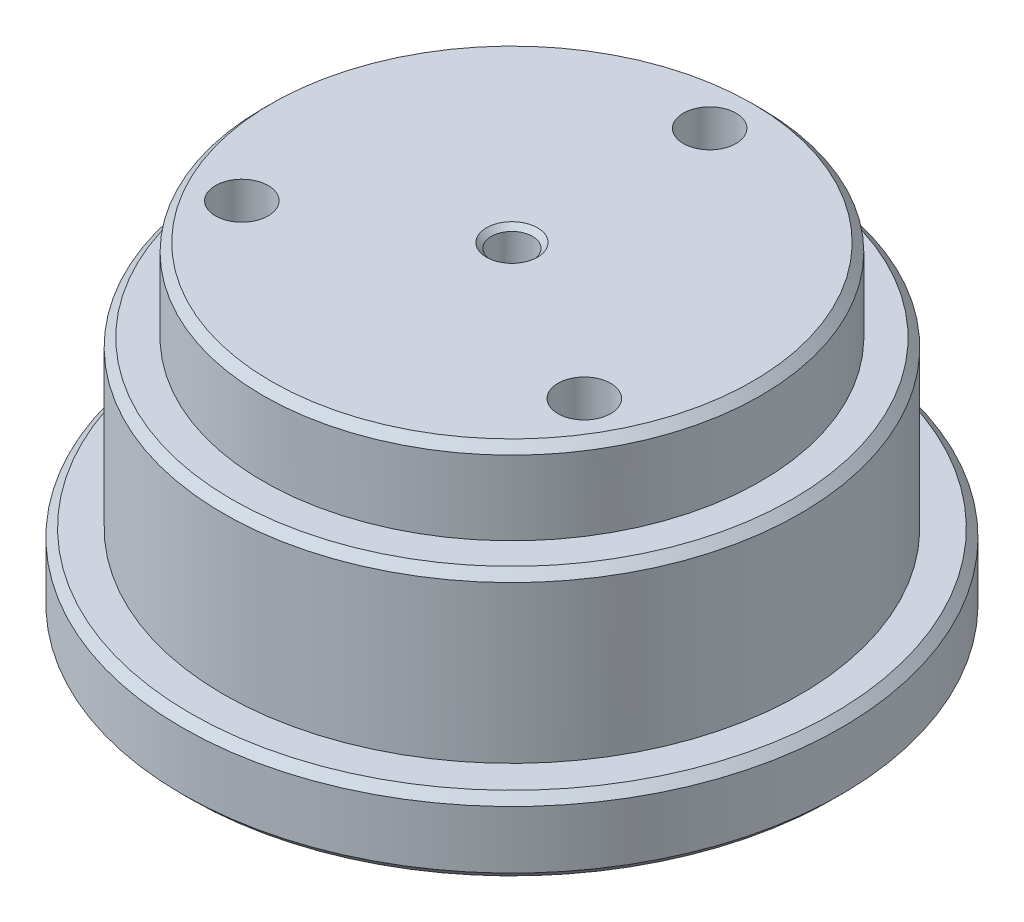
ISO-10303-21;
HEADER;
FILE_DESCRIPTION(('STEP AP214'),'2;1');
FILE_NAME('part.step','',(''),(''),'','','');
FILE_SCHEMA(('AUTOMOTIVE_DESIGN { 1 0 10303 214 1 1 1 1 }'));
ENDSEC;
DATA;
#1=APPLICATION_CONTEXT('core data for automotive mechanical design processes');
#2=APPLICATION_PROTOCOL_DEFINITION('international standard','automotive_design',2000,#1);
#3=PRODUCT_CONTEXT('',#1,'mechanical');
#4=PRODUCT('Part','Part','',(#3));
#5=PRODUCT_RELATED_PRODUCT_CATEGORY('part','',(#4));
#6=PRODUCT_DEFINITION_FORMATION('','',#4);
#7=PRODUCT_DEFINITION_CONTEXT('part definition',#1,'design');
#8=PRODUCT_DEFINITION('design','',#6,#7);
#9=PRODUCT_DEFINITION_SHAPE('','',#8);
#10=(LENGTH_UNIT() NAMED_UNIT(*) SI_UNIT(.MILLI.,.METRE.));
#11=(NAMED_UNIT(*) PLANE_ANGLE_UNIT() SI_UNIT($,.RADIAN.));
#12=(NAMED_UNIT(*) SI_UNIT($,.STERADIAN.) SOLID_ANGLE_UNIT());
#13=UNCERTAINTY_MEASURE_WITH_UNIT(LENGTH_MEASURE(1.E-05),#10,'distance_accuracy_value','');
#14=(GEOMETRIC_REPRESENTATION_CONTEXT(3) GLOBAL_UNCERTAINTY_ASSIGNED_CONTEXT((#13)) GLOBAL_UNIT_ASSIGNED_CONTEXT((#10,
#11,#12)) REPRESENTATION_CONTEXT('',''));
#15=CARTESIAN_POINT('',(0.,0.,0.));
#16=DIRECTION('',(0.,0.,1.));
#17=DIRECTION('',(1.,0.,0.));
#18=AXIS2_PLACEMENT_3D('',#15,#16,#17);
#19=CARTESIAN_POINT('',(0.,19.5,0.));
#20=DIRECTION('',(0.,-1.,0.));
#21=DIRECTION('',(0.,0.,-1.));
#22=AXIS2_PLACEMENT_3D('',#19,#20,#21);
#23=CYLINDRICAL_SURFACE('',#22,20.);
#24=CARTESIAN_POINT('',(0.,3.99999999999999,0.));
#25=DIRECTION('',(0.,1.,0.));
#26=DIRECTION('',(0.,0.,1.));
#27=AXIS2_PLACEMENT_3D('',#24,#25,#26);
#28=CIRCLE('',#27,20.);
#29=CARTESIAN_POINT('',(0.,3.99999999999999,20.));
#30=VERTEX_POINT('',#29);
#31=EDGE_CURVE('E68',#30,#30,#28,.F.);
#32=ORIENTED_EDGE('',*,*,#31,.T.);
#33=EDGE_LOOP('',(#32));
#34=FACE_BOUND('',#33,.T.);
#35=CARTESIAN_POINT('',(0.,0.499999999999997,0.));
#36=DIRECTION('',(0.,1.,0.));
#37=DIRECTION('',(0.,0.,1.));
#38=AXIS2_PLACEMENT_3D('',#35,#36,#37);
#39=CIRCLE('',#38,20.);
#40=CARTESIAN_POINT('',(0.,0.499999999999997,20.));
#41=VERTEX_POINT('',#40);
#42=EDGE_CURVE('E71',#41,#41,#39,.T.);
#43=ORIENTED_EDGE('',*,*,#42,.T.);
#44=EDGE_LOOP('',(#43));
#45=FACE_BOUND('',#44,.T.);
#46=ADVANCED_FACE('F33',(#34,#45),#23,.T.);
#47=CARTESIAN_POINT('',(0.,0.,0.));
#48=DIRECTION('',(0.,1.,0.));
#49=DIRECTION('',(0.,0.,1.));
#50=AXIS2_PLACEMENT_3D('',#47,#48,#49);
#51=PLANE('',#50);
#52=CARTESIAN_POINT('',(0.,0.,0.));
#53=DIRECTION('',(0.,1.,0.));
#54=DIRECTION('',(0.,0.,1.));
#55=AXIS2_PLACEMENT_3D('',#52,#53,#54);
#56=CIRCLE('',#55,3.3);
#57=CARTESIAN_POINT('',(0.,0.,3.3));
#58=VERTEX_POINT('',#57);
#59=EDGE_CURVE('E40',#58,#58,#56,.T.);
#60=ORIENTED_EDGE('',*,*,#59,.T.);
#61=EDGE_LOOP('',(#60));
#62=FACE_BOUND('',#61,.T.);
#63=CARTESIAN_POINT('',(0.,0.,0.));
#64=DIRECTION('',(0.,1.,0.));
#65=DIRECTION('',(0.,0.,1.));
#66=AXIS2_PLACEMENT_3D('',#63,#64,#65);
#67=CIRCLE('',#66,19.5);
#68=CARTESIAN_POINT('',(0.,0.,19.5));
#69=VERTEX_POINT('',#68);
#70=EDGE_CURVE('E65',#69,#69,#67,.F.);
#71=ORIENTED_EDGE('',*,*,#70,.T.);
#72=EDGE_LOOP('',(#71));
#73=FACE_BOUND('',#72,.T.);
#74=CARTESIAN_POINT('',(-10.3923048454132,0.,6.00000000000005));
#75=DIRECTION('',(0.,1.,0.));
#76=DIRECTION('',(0.866025403784436,0.,-0.500000000000004));
#77=AXIS2_PLACEMENT_3D('',#74,#75,#76);
#78=CIRCLE('',#77,3.25);
#79=CARTESIAN_POINT('',(-7.57772228311382,0.,4.37500000000004));
#80=VERTEX_POINT('',#79);
#81=EDGE_CURVE('E110',#80,#80,#78,.T.);
#82=ORIENTED_EDGE('',*,*,#81,.T.);
#83=EDGE_LOOP('',(#82));
#84=FACE_BOUND('',#83,.T.);
#85=CARTESIAN_POINT('',(10.3923048454133,0.,5.9999999999999));
#86=DIRECTION('',(0.,1.,0.));
#87=DIRECTION('',(-0.866025403784443,0.,-0.499999999999992));
#88=AXIS2_PLACEMENT_3D('',#85,#86,#87);
#89=CIRCLE('',#88,3.25);
#90=CARTESIAN_POINT('',(7.57772228311388,0.,4.37499999999993));
#91=VERTEX_POINT('',#90);
#92=EDGE_CURVE('E102',#91,#91,#89,.T.);
#93=ORIENTED_EDGE('',*,*,#92,.T.);
#94=EDGE_LOOP('',(#93));
#95=FACE_BOUND('',#94,.T.);
#96=CARTESIAN_POINT('',(0.,0.,-12.));
#97=DIRECTION('',(0.,1.,0.));
#98=DIRECTION('',(0.,0.,1.));
#99=AXIS2_PLACEMENT_3D('',#96,#97,#98);
#100=CIRCLE('',#99,3.25);
#101=CARTESIAN_POINT('',(0.,0.,-8.75));
#102=VERTEX_POINT('',#101);
#103=EDGE_CURVE('E87',#102,#102,#100,.T.);
#104=ORIENTED_EDGE('',*,*,#103,.T.);
#105=EDGE_LOOP('',(#104));
#106=FACE_BOUND('',#105,.T.);
#107=ADVANCED_FACE('F148',(#62,#73,#84,#95,#106),#51,.F.);
#108=CARTESIAN_POINT('',(0.,4.5,0.));
#109=DIRECTION('',(0.,1.,0.));
#110=DIRECTION('',(0.,0.,1.));
#111=AXIS2_PLACEMENT_3D('',#108,#109,#110);
#112=PLANE('',#111);
#113=CARTESIAN_POINT('',(0.,4.5,0.));
#114=DIRECTION('',(0.,1.,0.));
#115=DIRECTION('',(0.,0.,1.));
#116=AXIS2_PLACEMENT_3D('',#113,#114,#115);
#117=CIRCLE('',#116,19.5);
#118=CARTESIAN_POINT('',(0.,4.5,19.5));
#119=VERTEX_POINT('',#118);
#120=EDGE_CURVE('E74',#119,#119,#117,.T.);
#121=ORIENTED_EDGE('',*,*,#120,.T.);
#122=EDGE_LOOP('',(#121));
#123=FACE_BOUND('',#122,.T.);
#124=CARTESIAN_POINT('',(0.,4.5,0.));
#125=DIRECTION('',(0.,1.,0.));
#126=DIRECTION('',(0.,0.,1.));
#127=AXIS2_PLACEMENT_3D('',#124,#125,#126);
#128=CIRCLE('',#127,17.5);
#129=CARTESIAN_POINT('',(0.,4.5,17.5));
#130=VERTEX_POINT('',#129);
#131=EDGE_CURVE('E77',#130,#130,#128,.T.);
#132=ORIENTED_EDGE('',*,*,#131,.F.);
#133=EDGE_LOOP('',(#132));
#134=FACE_BOUND('',#133,.T.);
#135=ADVANCED_FACE('F155',(#123,#134),#112,.T.);
#136=CARTESIAN_POINT('',(0.,19.5,0.));
#137=DIRECTION('',(0.,-1.,0.));
#138=DIRECTION('',(0.,0.,-1.));
#139=AXIS2_PLACEMENT_3D('',#136,#137,#138);
#140=CYLINDRICAL_SURFACE('',#139,17.5);
#141=CARTESIAN_POINT('',(0.,14.,0.));
#142=DIRECTION('',(0.,-1.,0.));
#143=DIRECTION('',(0.,0.,-1.));
#144=AXIS2_PLACEMENT_3D('',#141,#142,#143);
#145=CIRCLE('',#144,17.5);
#146=CARTESIAN_POINT('',(0.,14.,-17.5));
#147=VERTEX_POINT('',#146);
#148=EDGE_CURVE('E56',#147,#147,#145,.T.);
#149=ORIENTED_EDGE('',*,*,#148,.T.);
#150=EDGE_LOOP('',(#149));
#151=FACE_BOUND('',#150,.T.);
#152=ORIENTED_EDGE('',*,*,#131,.T.);
#153=EDGE_LOOP('',(#152));
#154=FACE_BOUND('',#153,.T.);
#155=ADVANCED_FACE('F293',(#151,#154),#140,.T.);
#156=CARTESIAN_POINT('',(0.,14.5,0.));
#157=DIRECTION('',(0.,-1.,0.));
#158=DIRECTION('',(0.,0.,-1.));
#159=AXIS2_PLACEMENT_3D('',#156,#157,#158);
#160=PLANE('',#159);
#161=CARTESIAN_POINT('',(0.,14.5,0.));
#162=DIRECTION('',(0.,-1.,0.));
#163=DIRECTION('',(0.,0.,-1.));
#164=AXIS2_PLACEMENT_3D('',#161,#162,#163);
#165=CIRCLE('',#164,17.);
#166=CARTESIAN_POINT('',(0.,14.5,-17.));
#167=VERTEX_POINT('',#166);
#168=EDGE_CURVE('E53',#167,#167,#165,.F.);
#169=ORIENTED_EDGE('',*,*,#168,.T.);
#170=EDGE_LOOP('',(#169));
#171=FACE_BOUND('',#170,.T.);
#172=CARTESIAN_POINT('',(0.,14.5,0.));
#173=DIRECTION('',(0.,-1.,0.));
#174=DIRECTION('',(0.,0.,-1.));
#175=AXIS2_PLACEMENT_3D('',#172,#173,#174);
#176=CIRCLE('',#175,15.1);
#177=CARTESIAN_POINT('',(0.,14.5,-15.1));
#178=VERTEX_POINT('',#177);
#179=EDGE_CURVE('E80',#178,#178,#176,.T.);
#180=ORIENTED_EDGE('',*,*,#179,.T.);
#181=EDGE_LOOP('',(#180));
#182=FACE_BOUND('',#181,.T.);
#183=ADVANCED_FACE('F303',(#171,#182),#160,.F.);
#184=CARTESIAN_POINT('',(0.,20.5,0.));
#185=DIRECTION('',(0.,-1.,0.));
#186=DIRECTION('',(0.,0.,-1.));
#187=AXIS2_PLACEMENT_3D('',#184,#185,#186);
#188=CYLINDRICAL_SURFACE('',#187,15.1);
#189=CARTESIAN_POINT('',(0.,19.,0.));
#190=DIRECTION('',(0.,1.,0.));
#191=DIRECTION('',(0.,0.,1.));
#192=AXIS2_PLACEMENT_3D('',#189,#190,#191);
#193=CIRCLE('',#192,15.1);
#194=CARTESIAN_POINT('',(0.,19.,15.1));
#195=VERTEX_POINT('',#194);
#196=EDGE_CURVE('E59',#195,#195,#193,.F.);
#197=ORIENTED_EDGE('',*,*,#196,.T.);
#198=EDGE_LOOP('',(#197));
#199=FACE_BOUND('',#198,.T.);
#200=ORIENTED_EDGE('',*,*,#179,.F.);
#201=EDGE_LOOP('',(#200));
#202=FACE_BOUND('',#201,.T.);
#203=ADVANCED_FACE('F143',(#199,#202),#188,.T.);
#204=CARTESIAN_POINT('',(0.,19.5,0.));
#205=DIRECTION('',(0.,1.,0.));
#206=DIRECTION('',(0.,0.,1.));
#207=AXIS2_PLACEMENT_3D('',#204,#205,#206);
#208=PLANE('',#207);
#209=CARTESIAN_POINT('',(0.,19.5,0.));
#210=DIRECTION('',(0.,1.,0.));
#211=DIRECTION('',(0.,0.,1.));
#212=AXIS2_PLACEMENT_3D('',#209,#210,#211);
#213=CIRCLE('',#212,1.55000000000001);
#214=CARTESIAN_POINT('',(0.,19.5,1.55000000000001));
#215=VERTEX_POINT('',#214);
#216=EDGE_CURVE('E44',#215,#215,#213,.F.);
#217=ORIENTED_EDGE('',*,*,#216,.T.);
#218=EDGE_LOOP('',(#217));
#219=FACE_BOUND('',#218,.T.);
#220=CARTESIAN_POINT('',(0.,19.5,0.));
#221=DIRECTION('',(0.,1.,0.));
#222=DIRECTION('',(0.,0.,1.));
#223=AXIS2_PLACEMENT_3D('',#220,#221,#222);
#224=CIRCLE('',#223,14.6);
#225=CARTESIAN_POINT('',(0.,19.5,14.6));
#226=VERTEX_POINT('',#225);
#227=EDGE_CURVE('E62',#226,#226,#224,.T.);
#228=ORIENTED_EDGE('',*,*,#227,.T.);
#229=EDGE_LOOP('',(#228));
#230=FACE_BOUND('',#229,.T.);
#231=CARTESIAN_POINT('',(-10.3923048454132,19.5,6.00000000000005));
#232=DIRECTION('',(0.,1.,0.));
#233=DIRECTION('',(0.866025403784436,0.,-0.500000000000004));
#234=AXIS2_PLACEMENT_3D('',#231,#232,#233);
#235=CIRCLE('',#234,1.6);
#236=CARTESIAN_POINT('',(-9.00666419935814,19.5,5.20000000000004));
#237=VERTEX_POINT('',#236);
#238=EDGE_CURVE('E91',#237,#237,#235,.T.);
#239=ORIENTED_EDGE('',*,*,#238,.F.);
#240=EDGE_LOOP('',(#239));
#241=FACE_BOUND('',#240,.T.);
#242=CARTESIAN_POINT('',(10.3923048454133,19.5,5.9999999999999));
#243=DIRECTION('',(0.,1.,0.));
#244=DIRECTION('',(-0.866025403784443,0.,-0.499999999999992));
#245=AXIS2_PLACEMENT_3D('',#242,#243,#244);
#246=CIRCLE('',#245,1.6);
#247=CARTESIAN_POINT('',(9.00666419935821,19.5,5.19999999999992));
#248=VERTEX_POINT('',#247);
#249=EDGE_CURVE('E96',#248,#248,#246,.T.);
#250=ORIENTED_EDGE('',*,*,#249,.F.);
#251=EDGE_LOOP('',(#250));
#252=FACE_BOUND('',#251,.T.);
#253=CARTESIAN_POINT('',(0.,19.5,-12.));
#254=DIRECTION('',(0.,1.,0.));
#255=DIRECTION('',(0.,0.,1.));
#256=AXIS2_PLACEMENT_3D('',#253,#254,#255);
#257=CIRCLE('',#256,1.6);
#258=CARTESIAN_POINT('',(0.,19.5,-10.4));
#259=VERTEX_POINT('',#258);
#260=EDGE_CURVE('E83',#259,#259,#257,.T.);
#261=ORIENTED_EDGE('',*,*,#260,.F.);
#262=EDGE_LOOP('',(#261));
#263=FACE_BOUND('',#262,.T.);
#264=ADVANCED_FACE('F132',(#219,#230,#241,#252,#263),#208,.T.);
#265=CARTESIAN_POINT('',(0.,19.5,0.));
#266=DIRECTION('',(0.,-1.,0.));
#267=DIRECTION('',(0.,0.,-1.));
#268=AXIS2_PLACEMENT_3D('',#265,#266,#267);
#269=CYLINDRICAL_SURFACE('',#268,1.25);
#270=CARTESIAN_POINT('',(0.,19.2,0.));
#271=DIRECTION('',(0.,1.,0.));
#272=DIRECTION('',(0.,0.,1.));
#273=AXIS2_PLACEMENT_3D('',#270,#271,#272);
#274=CIRCLE('',#273,1.25);
#275=CARTESIAN_POINT('',(0.,19.2,1.25));
#276=VERTEX_POINT('',#275);
#277=EDGE_CURVE('E48',#276,#276,#274,.T.);
#278=ORIENTED_EDGE('',*,*,#277,.T.);
#279=EDGE_LOOP('',(#278));
#280=FACE_BOUND('',#279,.T.);
#281=CARTESIAN_POINT('',(0.,4.,0.));
#282=DIRECTION('',(0.,1.,0.));
#283=DIRECTION('',(0.,0.,1.));
#284=AXIS2_PLACEMENT_3D('',#281,#282,#283);
#285=CIRCLE('',#284,1.25);
#286=CARTESIAN_POINT('',(0.,4.,1.25));
#287=VERTEX_POINT('',#286);
#288=EDGE_CURVE('E122',#287,#287,#285,.T.);
#289=ORIENTED_EDGE('',*,*,#288,.F.);
#290=EDGE_LOOP('',(#289));
#291=FACE_BOUND('',#290,.T.);
#292=ADVANCED_FACE('F129',(#280,#291),#269,.F.);
#293=CARTESIAN_POINT('',(0.,19.5,-12.));
#294=DIRECTION('',(0.,-1.,0.));
#295=DIRECTION('',(0.,0.,-1.));
#296=AXIS2_PLACEMENT_3D('',#293,#294,#295);
#297=CYLINDRICAL_SURFACE('',#296,1.6);
#298=CARTESIAN_POINT('',(0.,4.,-12.));
#299=DIRECTION('',(0.,1.,0.));
#300=DIRECTION('',(0.,0.,1.));
#301=AXIS2_PLACEMENT_3D('',#298,#299,#300);
#302=CIRCLE('',#301,1.6);
#303=CARTESIAN_POINT('',(0.,4.,-10.4));
#304=VERTEX_POINT('',#303);
#305=EDGE_CURVE('E90',#304,#304,#302,.T.);
#306=ORIENTED_EDGE('',*,*,#305,.F.);
#307=EDGE_LOOP('',(#306));
#308=FACE_BOUND('',#307,.T.);
#309=ORIENTED_EDGE('',*,*,#260,.T.);
#310=EDGE_LOOP('',(#309));
#311=FACE_BOUND('',#310,.T.);
#312=ADVANCED_FACE('F131',(#308,#311),#297,.F.);
#313=CARTESIAN_POINT('',(0.,4.,-12.));
#314=DIRECTION('',(0.,-1.,0.));
#315=DIRECTION('',(0.,0.,-1.));
#316=AXIS2_PLACEMENT_3D('',#313,#314,#315);
#317=CYLINDRICAL_SURFACE('',#316,3.25);
#318=CARTESIAN_POINT('',(0.,4.,-12.));
#319=DIRECTION('',(0.,1.,0.));
#320=DIRECTION('',(0.,0.,1.));
#321=AXIS2_PLACEMENT_3D('',#318,#319,#320);
#322=CIRCLE('',#321,3.25);
#323=CARTESIAN_POINT('',(0.,4.,-8.75));
#324=VERTEX_POINT('',#323);
#325=EDGE_CURVE('E86',#324,#324,#322,.T.);
#326=ORIENTED_EDGE('',*,*,#325,.T.);
#327=EDGE_LOOP('',(#326));
#328=FACE_BOUND('',#327,.T.);
#329=ORIENTED_EDGE('',*,*,#103,.F.);
#330=EDGE_LOOP('',(#329));
#331=FACE_BOUND('',#330,.T.);
#332=ADVANCED_FACE('F140',(#328,#331),#317,.F.);
#333=CARTESIAN_POINT('',(0.,4.,0.));
#334=DIRECTION('',(0.,1.,0.));
#335=DIRECTION('',(0.,0.,1.));
#336=AXIS2_PLACEMENT_3D('',#333,#334,#335);
#337=PLANE('',#336);
#338=ORIENTED_EDGE('',*,*,#305,.T.);
#339=EDGE_LOOP('',(#338));
#340=FACE_BOUND('',#339,.T.);
#341=ORIENTED_EDGE('',*,*,#325,.F.);
#342=EDGE_LOOP('',(#341));
#343=FACE_BOUND('',#342,.T.);
#344=ADVANCED_FACE('F201',(#340,#343),#337,.F.);
#345=CARTESIAN_POINT('',(10.3923048454133,19.5,5.9999999999999));
#346=DIRECTION('',(0.,-1.,0.));
#347=DIRECTION('',(0.,0.,-1.));
#348=AXIS2_PLACEMENT_3D('',#345,#346,#347);
#349=CYLINDRICAL_SURFACE('',#348,1.6);
#350=CARTESIAN_POINT('',(10.3923048454133,4.,5.9999999999999));
#351=DIRECTION('',(0.,1.,0.));
#352=DIRECTION('',(-0.866025403784443,0.,-0.499999999999992));
#353=AXIS2_PLACEMENT_3D('',#350,#351,#352);
#354=CIRCLE('',#353,1.6);
#355=CARTESIAN_POINT('',(9.00666419935821,4.,5.19999999999992));
#356=VERTEX_POINT('',#355);
#357=EDGE_CURVE('E105',#356,#356,#354,.T.);
#358=ORIENTED_EDGE('',*,*,#357,.F.);
#359=EDGE_LOOP('',(#358));
#360=FACE_BOUND('',#359,.T.);
#361=ORIENTED_EDGE('',*,*,#249,.T.);
#362=EDGE_LOOP('',(#361));
#363=FACE_BOUND('',#362,.T.);
#364=ADVANCED_FACE('F198',(#360,#363),#349,.F.);
#365=CARTESIAN_POINT('',(-10.3923048454132,19.5,6.00000000000005));
#366=DIRECTION('',(0.,-1.,0.));
#367=DIRECTION('',(0.,0.,-1.));
#368=AXIS2_PLACEMENT_3D('',#365,#366,#367);
#369=CYLINDRICAL_SURFACE('',#368,1.6);
#370=CARTESIAN_POINT('',(-10.3923048454132,4.,6.00000000000005));
#371=DIRECTION('',(0.,1.,0.));
#372=DIRECTION('',(0.866025403784436,0.,-0.500000000000004));
#373=AXIS2_PLACEMENT_3D('',#370,#371,#372);
#374=CIRCLE('',#373,1.6);
#375=CARTESIAN_POINT('',(-9.00666419935814,4.,5.20000000000004));
#376=VERTEX_POINT('',#375);
#377=EDGE_CURVE('E115',#376,#376,#374,.T.);
#378=ORIENTED_EDGE('',*,*,#377,.F.);
#379=EDGE_LOOP('',(#378));
#380=FACE_BOUND('',#379,.T.);
#381=ORIENTED_EDGE('',*,*,#238,.T.);
#382=EDGE_LOOP('',(#381));
#383=FACE_BOUND('',#382,.T.);
#384=ADVANCED_FACE('F200',(#380,#383),#369,.F.);
#385=CARTESIAN_POINT('',(-10.3923048454132,4.,6.00000000000005));
#386=DIRECTION('',(0.,-1.,0.));
#387=DIRECTION('',(0.,0.,-1.));
#388=AXIS2_PLACEMENT_3D('',#385,#386,#387);
#389=CYLINDRICAL_SURFACE('',#388,3.25);
#390=CARTESIAN_POINT('',(-10.3923048454132,4.,6.00000000000005));
#391=DIRECTION('',(0.,1.,0.));
#392=DIRECTION('',(0.866025403784436,0.,-0.500000000000004));
#393=AXIS2_PLACEMENT_3D('',#390,#391,#392);
#394=CIRCLE('',#393,3.25);
#395=CARTESIAN_POINT('',(-7.57772228311382,4.,4.37500000000004));
#396=VERTEX_POINT('',#395);
#397=EDGE_CURVE('E99',#396,#396,#394,.T.);
#398=ORIENTED_EDGE('',*,*,#397,.T.);
#399=EDGE_LOOP('',(#398));
#400=FACE_BOUND('',#399,.T.);
#401=ORIENTED_EDGE('',*,*,#81,.F.);
#402=EDGE_LOOP('',(#401));
#403=FACE_BOUND('',#402,.T.);
#404=ADVANCED_FACE('F208',(#400,#403),#389,.F.);
#405=CARTESIAN_POINT('',(0.,4.,0.));
#406=DIRECTION('',(0.,1.,0.));
#407=DIRECTION('',(0.866025403784436,0.,-0.500000000000004));
#408=AXIS2_PLACEMENT_3D('',#405,#406,#407);
#409=PLANE('',#408);
#410=ORIENTED_EDGE('',*,*,#377,.T.);
#411=EDGE_LOOP('',(#410));
#412=FACE_BOUND('',#411,.T.);
#413=ORIENTED_EDGE('',*,*,#397,.F.);
#414=EDGE_LOOP('',(#413));
#415=FACE_BOUND('',#414,.T.);
#416=ADVANCED_FACE('F250',(#412,#415),#409,.F.);
#417=CARTESIAN_POINT('',(10.3923048454133,4.,5.9999999999999));
#418=DIRECTION('',(0.,-1.,0.));
#419=DIRECTION('',(0.,0.,-1.));
#420=AXIS2_PLACEMENT_3D('',#417,#418,#419);
#421=CYLINDRICAL_SURFACE('',#420,3.25);
#422=CARTESIAN_POINT('',(10.3923048454133,4.,5.9999999999999));
#423=DIRECTION('',(0.,1.,0.));
#424=DIRECTION('',(-0.866025403784443,0.,-0.499999999999992));
#425=AXIS2_PLACEMENT_3D('',#422,#423,#424);
#426=CIRCLE('',#425,3.25);
#427=CARTESIAN_POINT('',(7.57772228311388,4.,4.37499999999993));
#428=VERTEX_POINT('',#427);
#429=EDGE_CURVE('E107',#428,#428,#426,.T.);
#430=ORIENTED_EDGE('',*,*,#429,.T.);
#431=EDGE_LOOP('',(#430));
#432=FACE_BOUND('',#431,.T.);
#433=ORIENTED_EDGE('',*,*,#92,.F.);
#434=EDGE_LOOP('',(#433));
#435=FACE_BOUND('',#434,.T.);
#436=ADVANCED_FACE('F260',(#432,#435),#421,.F.);
#437=CARTESIAN_POINT('',(0.,4.,0.));
#438=DIRECTION('',(0.,1.,0.));
#439=DIRECTION('',(-0.866025403784443,0.,-0.499999999999992));
#440=AXIS2_PLACEMENT_3D('',#437,#438,#439);
#441=PLANE('',#440);
#442=ORIENTED_EDGE('',*,*,#357,.T.);
#443=EDGE_LOOP('',(#442));
#444=FACE_BOUND('',#443,.T.);
#445=ORIENTED_EDGE('',*,*,#429,.F.);
#446=EDGE_LOOP('',(#445));
#447=FACE_BOUND('',#446,.T.);
#448=ADVANCED_FACE('F163',(#444,#447),#441,.F.);
#449=CARTESIAN_POINT('',(0.,4.5,0.));
#450=DIRECTION('',(0.,-1.,0.));
#451=DIRECTION('',(0.,0.,-1.));
#452=AXIS2_PLACEMENT_3D('',#449,#450,#451);
#453=CONICAL_SURFACE('',#452,19.5,0.785398163397441);
#454=ORIENTED_EDGE('',*,*,#31,.F.);
#455=EDGE_LOOP('',(#454));
#456=FACE_BOUND('',#455,.T.);
#457=ORIENTED_EDGE('',*,*,#120,.F.);
#458=EDGE_LOOP('',(#457));
#459=FACE_BOUND('',#458,.T.);
#460=ADVANCED_FACE('F159',(#456,#459),#453,.T.);
#461=CARTESIAN_POINT('',(0.,0.499999999999997,0.));
#462=DIRECTION('',(0.,1.,0.));
#463=DIRECTION('',(0.,0.,1.));
#464=AXIS2_PLACEMENT_3D('',#461,#462,#463);
#465=CONICAL_SURFACE('',#464,20.,0.785398163397452);
#466=ORIENTED_EDGE('',*,*,#70,.F.);
#467=EDGE_LOOP('',(#466));
#468=FACE_BOUND('',#467,.T.);
#469=ORIENTED_EDGE('',*,*,#42,.F.);
#470=EDGE_LOOP('',(#469));
#471=FACE_BOUND('',#470,.T.);
#472=ADVANCED_FACE('F162',(#468,#471),#465,.T.);
#473=CARTESIAN_POINT('',(0.,19.5,0.));
#474=DIRECTION('',(0.,-1.,0.));
#475=DIRECTION('',(0.,0.,-1.));
#476=AXIS2_PLACEMENT_3D('',#473,#474,#475);
#477=CONICAL_SURFACE('',#476,14.6,0.785398163397441);
#478=ORIENTED_EDGE('',*,*,#196,.F.);
#479=EDGE_LOOP('',(#478));
#480=FACE_BOUND('',#479,.T.);
#481=ORIENTED_EDGE('',*,*,#227,.F.);
#482=EDGE_LOOP('',(#481));
#483=FACE_BOUND('',#482,.T.);
#484=ADVANCED_FACE('F167',(#480,#483),#477,.T.);
#485=CARTESIAN_POINT('',(0.,14.,0.));
#486=DIRECTION('',(0.,-1.,0.));
#487=DIRECTION('',(0.,0.,-1.));
#488=AXIS2_PLACEMENT_3D('',#485,#486,#487);
#489=CONICAL_SURFACE('',#488,17.5,0.785398163397448);
#490=ORIENTED_EDGE('',*,*,#168,.F.);
#491=EDGE_LOOP('',(#490));
#492=FACE_BOUND('',#491,.T.);
#493=ORIENTED_EDGE('',*,*,#148,.F.);
#494=EDGE_LOOP('',(#493));
#495=FACE_BOUND('',#494,.T.);
#496=ADVANCED_FACE('F171',(#492,#495),#489,.T.);
#497=CARTESIAN_POINT('',(0.,4.,0.));
#498=DIRECTION('',(0.,-1.,0.));
#499=DIRECTION('',(0.,0.,-1.));
#500=AXIS2_PLACEMENT_3D('',#497,#498,#499);
#501=CYLINDRICAL_SURFACE('',#500,3.);
#502=CARTESIAN_POINT('',(0.,0.300000000000011,0.));
#503=DIRECTION('',(0.,1.,0.));
#504=DIRECTION('',(0.,0.,1.));
#505=AXIS2_PLACEMENT_3D('',#502,#503,#504);
#506=CIRCLE('',#505,3.);
#507=CARTESIAN_POINT('',(0.,0.300000000000011,3.));
#508=VERTEX_POINT('',#507);
#509=EDGE_CURVE('E11',#508,#508,#506,.F.);
#510=ORIENTED_EDGE('',*,*,#509,.T.);
#511=EDGE_LOOP('',(#510));
#512=FACE_BOUND('',#511,.T.);
#513=CARTESIAN_POINT('',(0.,4.,0.));
#514=DIRECTION('',(0.,1.,0.));
#515=DIRECTION('',(0.,0.,1.));
#516=AXIS2_PLACEMENT_3D('',#513,#514,#515);
#517=CIRCLE('',#516,3.);
#518=CARTESIAN_POINT('',(0.,4.,3.));
#519=VERTEX_POINT('',#518);
#520=EDGE_CURVE('E106',#519,#519,#517,.T.);
#521=ORIENTED_EDGE('',*,*,#520,.T.);
#522=EDGE_LOOP('',(#521));
#523=FACE_BOUND('',#522,.T.);
#524=ADVANCED_FACE('F174',(#512,#523),#501,.F.);
#525=CARTESIAN_POINT('',(0.,4.,0.));
#526=DIRECTION('',(0.,1.,0.));
#527=DIRECTION('',(0.,0.,1.));
#528=AXIS2_PLACEMENT_3D('',#525,#526,#527);
#529=PLANE('',#528);
#530=ORIENTED_EDGE('',*,*,#288,.T.);
#531=EDGE_LOOP('',(#530));
#532=FACE_BOUND('',#531,.T.);
#533=ORIENTED_EDGE('',*,*,#520,.F.);
#534=EDGE_LOOP('',(#533));
#535=FACE_BOUND('',#534,.T.);
#536=ADVANCED_FACE('F126',(#532,#535),#529,.F.);
#537=CARTESIAN_POINT('',(0.,19.2,0.));
#538=DIRECTION('',(0.,1.,0.));
#539=DIRECTION('',(0.,0.,1.));
#540=AXIS2_PLACEMENT_3D('',#537,#538,#539);
#541=CONICAL_SURFACE('',#540,1.25,0.785398163397444);
#542=ORIENTED_EDGE('',*,*,#216,.F.);
#543=EDGE_LOOP('',(#542));
#544=FACE_BOUND('',#543,.T.);
#545=ORIENTED_EDGE('',*,*,#277,.F.);
#546=EDGE_LOOP('',(#545));
#547=FACE_BOUND('',#546,.T.);
#548=ADVANCED_FACE('F176',(#544,#547),#541,.F.);
#549=CARTESIAN_POINT('',(0.,0.,0.));
#550=DIRECTION('',(0.,-1.,0.));
#551=DIRECTION('',(0.,0.,-1.));
#552=AXIS2_PLACEMENT_3D('',#549,#550,#551);
#553=CONICAL_SURFACE('',#552,3.3,0.785398163397437);
#554=ORIENTED_EDGE('',*,*,#509,.F.);
#555=EDGE_LOOP('',(#554));
#556=FACE_BOUND('',#555,.T.);
#557=ORIENTED_EDGE('',*,*,#59,.F.);
#558=EDGE_LOOP('',(#557));
#559=FACE_BOUND('',#558,.T.);
#560=ADVANCED_FACE('F35',(#556,#559),#553,.F.);
#561=CLOSED_SHELL('',(#46,#107,#135,#155,#183,#203,#264,#292,#312,#332,#344,#364,#384,#404,#416,
#436,#448,#460,#472,#484,#496,#524,#536,#548,#560));
#562=MANIFOLD_SOLID_BREP('B2',#561);
#563=ADVANCED_BREP_SHAPE_REPRESENTATION('',(#18,#562),#14);
#564=SHAPE_DEFINITION_REPRESENTATION(#9,#563);
ENDSEC;
END-ISO-10303-21;
